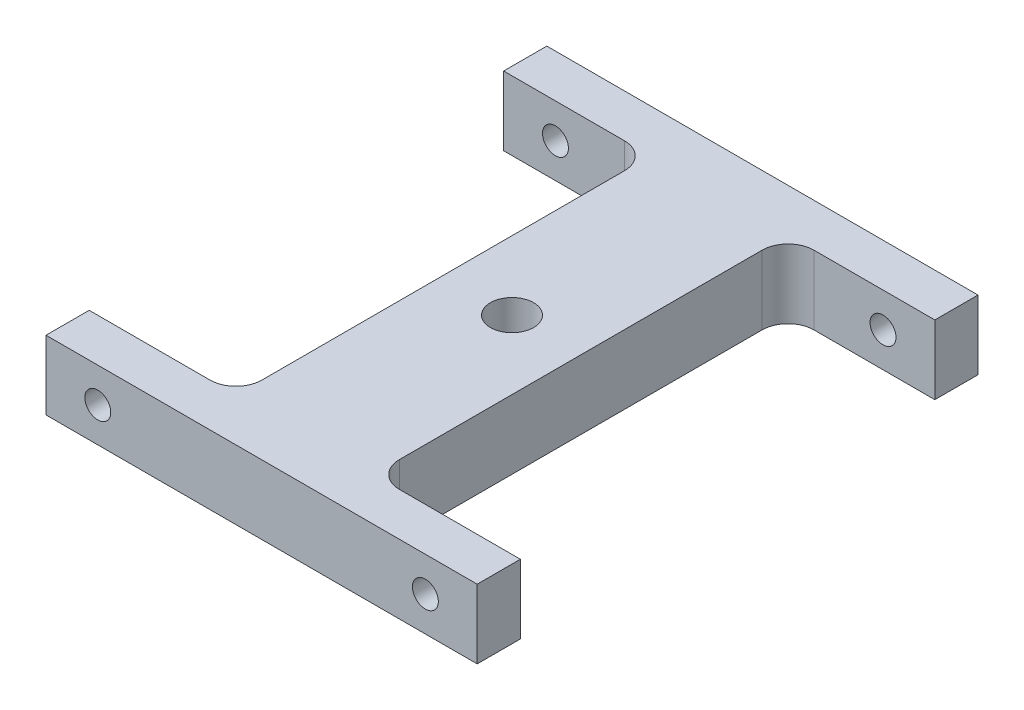
ISO-10303-21;
HEADER;
FILE_DESCRIPTION(('STEP AP214'),'2;1');
FILE_NAME('part.step','',(''),(''),'','','');
FILE_SCHEMA(('AUTOMOTIVE_DESIGN { 1 0 10303 214 1 1 1 1 }'));
ENDSEC;
DATA;
#1=APPLICATION_CONTEXT('core data for automotive mechanical design processes');
#2=APPLICATION_PROTOCOL_DEFINITION('international standard','automotive_design',2000,#1);
#3=PRODUCT_CONTEXT('',#1,'mechanical');
#4=PRODUCT('Part','Part','',(#3));
#5=PRODUCT_RELATED_PRODUCT_CATEGORY('part','',(#4));
#6=PRODUCT_DEFINITION_FORMATION('','',#4);
#7=PRODUCT_DEFINITION_CONTEXT('part definition',#1,'design');
#8=PRODUCT_DEFINITION('design','',#6,#7);
#9=PRODUCT_DEFINITION_SHAPE('','',#8);
#10=(LENGTH_UNIT() NAMED_UNIT(*) SI_UNIT(.MILLI.,.METRE.));
#11=(NAMED_UNIT(*) PLANE_ANGLE_UNIT() SI_UNIT($,.RADIAN.));
#12=(NAMED_UNIT(*) SI_UNIT($,.STERADIAN.) SOLID_ANGLE_UNIT());
#13=UNCERTAINTY_MEASURE_WITH_UNIT(LENGTH_MEASURE(1.E-05),#10,'distance_accuracy_value','');
#14=(GEOMETRIC_REPRESENTATION_CONTEXT(3) GLOBAL_UNCERTAINTY_ASSIGNED_CONTEXT((#13)) GLOBAL_UNIT_ASSIGNED_CONTEXT((#10,
#11,#12)) REPRESENTATION_CONTEXT('',''));
#15=CARTESIAN_POINT('',(0.,0.,0.));
#16=DIRECTION('',(0.,0.,1.));
#17=DIRECTION('',(1.,0.,0.));
#18=AXIS2_PLACEMENT_3D('',#15,#16,#17);
#19=CARTESIAN_POINT('',(-24.9677831353781,-110.,58.));
#20=DIRECTION('',(1.,0.,0.));
#21=DIRECTION('',(0.,0.,-1.));
#22=AXIS2_PLACEMENT_3D('',#19,#20,#21);
#23=PLANE('',#22);
#24=DIRECTION('',(0.,0.,-1.));
#25=VECTOR('',#24,1.);
#26=CARTESIAN_POINT('',(-24.9677831353781,-102.,58.));
#27=LINE('',#26,#25);
#28=CARTESIAN_POINT('',(-24.9677831353781,-102.,58.));
#29=VERTEX_POINT('',#28);
#30=CARTESIAN_POINT('',(-24.9677831353781,-102.,52.9999999999994));
#31=VERTEX_POINT('',#30);
#32=EDGE_CURVE('E297',#29,#31,#27,.T.);
#33=ORIENTED_EDGE('',*,*,#32,.T.);
#34=DIRECTION('',(0.,-1.,0.));
#35=VECTOR('',#34,1.);
#36=CARTESIAN_POINT('',(-24.9677831353781,-54.,52.9999999999994));
#37=LINE('',#36,#35);
#38=CARTESIAN_POINT('',(-24.9677831353781,-110.,52.9999999999994));
#39=VERTEX_POINT('',#38);
#40=EDGE_CURVE('E245',#31,#39,#37,.T.);
#41=ORIENTED_EDGE('',*,*,#40,.T.);
#42=DIRECTION('',(0.,0.,-1.));
#43=VECTOR('',#42,1.);
#44=CARTESIAN_POINT('',(-24.9677831353781,-110.,58.));
#45=LINE('',#44,#43);
#46=CARTESIAN_POINT('',(-24.9677831353781,-110.,58.));
#47=VERTEX_POINT('',#46);
#48=EDGE_CURVE('E174',#47,#39,#45,.T.);
#49=ORIENTED_EDGE('',*,*,#48,.F.);
#50=DIRECTION('',(0.,-1.,0.));
#51=VECTOR('',#50,1.);
#52=CARTESIAN_POINT('',(-24.9677831353781,-110.,58.));
#53=LINE('',#52,#51);
#54=EDGE_CURVE('E278',#29,#47,#53,.T.);
#55=ORIENTED_EDGE('',*,*,#54,.F.);
#56=EDGE_LOOP('',(#33,#41,#49,#55));
#57=FACE_BOUND('',#56,.T.);
#58=ADVANCED_FACE('F35',(#57),#23,.F.);
#59=CARTESIAN_POINT('',(24.967783135378,-110.,58.));
#60=DIRECTION('',(-1.,0.,0.));
#61=DIRECTION('',(0.,0.,1.));
#62=AXIS2_PLACEMENT_3D('',#59,#60,#61);
#63=PLANE('',#62);
#64=DIRECTION('',(0.,0.,-1.));
#65=VECTOR('',#64,1.);
#66=CARTESIAN_POINT('',(24.967783135378,-102.,58.));
#67=LINE('',#66,#65);
#68=CARTESIAN_POINT('',(24.9677831353781,-102.,5.));
#69=VERTEX_POINT('',#68);
#70=CARTESIAN_POINT('',(24.967783135378,-102.,0.));
#71=VERTEX_POINT('',#70);
#72=EDGE_CURVE('E299',#69,#71,#67,.T.);
#73=ORIENTED_EDGE('',*,*,#72,.F.);
#74=DIRECTION('',(0.,-1.,0.));
#75=VECTOR('',#74,1.);
#76=CARTESIAN_POINT('',(24.9677831353781,-54.,5.));
#77=LINE('',#76,#75);
#78=CARTESIAN_POINT('',(24.9677831353781,-110.,5.));
#79=VERTEX_POINT('',#78);
#80=EDGE_CURVE('E169',#69,#79,#77,.T.);
#81=ORIENTED_EDGE('',*,*,#80,.T.);
#82=DIRECTION('',(0.,0.,-1.));
#83=VECTOR('',#82,1.);
#84=CARTESIAN_POINT('',(24.967783135378,-110.,58.));
#85=LINE('',#84,#83);
#86=CARTESIAN_POINT('',(24.967783135378,-110.,0.));
#87=VERTEX_POINT('',#86);
#88=EDGE_CURVE('E179',#79,#87,#85,.T.);
#89=ORIENTED_EDGE('',*,*,#88,.T.);
#90=DIRECTION('',(0.,1.,0.));
#91=VECTOR('',#90,1.);
#92=CARTESIAN_POINT('',(24.967783135378,-110.,0.));
#93=LINE('',#92,#91);
#94=EDGE_CURVE('E292',#87,#71,#93,.T.);
#95=ORIENTED_EDGE('',*,*,#94,.T.);
#96=EDGE_LOOP('',(#73,#81,#89,#95));
#97=FACE_BOUND('',#96,.T.);
#98=ADVANCED_FACE('F310',(#97),#63,.F.);
#99=CARTESIAN_POINT('',(-24.9677831353781,-110.,4.99999999999999));
#100=VERTEX_POINT('',#99);
#101=CARTESIAN_POINT('',(-24.9677831353781,-110.,0.));
#102=VERTEX_POINT('',#101);
#103=EDGE_CURVE('E164',#100,#102,#45,.T.);
#104=ORIENTED_EDGE('',*,*,#103,.F.);
#105=DIRECTION('',(0.,-1.,0.));
#106=VECTOR('',#105,1.);
#107=CARTESIAN_POINT('',(-24.9677831353781,-54.,4.99999999999999));
#108=LINE('',#107,#106);
#109=CARTESIAN_POINT('',(-24.9677831353781,-102.,4.99999999999999));
#110=VERTEX_POINT('',#109);
#111=EDGE_CURVE('E148',#110,#100,#108,.T.);
#112=ORIENTED_EDGE('',*,*,#111,.F.);
#113=CARTESIAN_POINT('',(-24.9677831353781,-102.,0.));
#114=VERTEX_POINT('',#113);
#115=EDGE_CURVE('E288',#110,#114,#27,.T.);
#116=ORIENTED_EDGE('',*,*,#115,.T.);
#117=DIRECTION('',(0.,-1.,0.));
#118=VECTOR('',#117,1.);
#119=CARTESIAN_POINT('',(-24.9677831353781,-110.,0.));
#120=LINE('',#119,#118);
#121=EDGE_CURVE('E173',#114,#102,#120,.T.);
#122=ORIENTED_EDGE('',*,*,#121,.T.);
#123=EDGE_LOOP('',(#104,#112,#116,#122));
#124=FACE_BOUND('',#123,.T.);
#125=ADVANCED_FACE('F37',(#124),#23,.F.);
#126=CARTESIAN_POINT('',(-24.9677831353781,-110.,58.));
#127=DIRECTION('',(0.,1.,0.));
#128=DIRECTION('',(0.,0.,1.));
#129=AXIS2_PLACEMENT_3D('',#126,#127,#128);
#130=PLANE('',#129);
#131=CARTESIAN_POINT('',(0.,-110.,28.9999999999997));
#132=DIRECTION('',(0.,-1.,0.));
#133=DIRECTION('',(0.,0.,-1.));
#134=AXIS2_PLACEMENT_3D('',#131,#132,#133);
#135=CIRCLE('',#134,2.5);
#136=CARTESIAN_POINT('',(0.,-110.,26.4999999999997));
#137=VERTEX_POINT('',#136);
#138=EDGE_CURVE('E215',#137,#137,#135,.T.);
#139=ORIENTED_EDGE('',*,*,#138,.F.);
#140=EDGE_LOOP('',(#139));
#141=FACE_BOUND('',#140,.T.);
#142=ORIENTED_EDGE('',*,*,#48,.T.);
#143=DIRECTION('',(-1.,0.,0.));
#144=VECTOR('',#143,1.);
#145=CARTESIAN_POINT('',(-24.9677831353781,-110.,52.9999999999994));
#146=LINE('',#145,#144);
#147=CARTESIAN_POINT('',(-10.9677831353781,-110.,52.9999999999994));
#148=VERTEX_POINT('',#147);
#149=EDGE_CURVE('E158',#148,#39,#146,.T.);
#150=ORIENTED_EDGE('',*,*,#149,.F.);
#151=CARTESIAN_POINT('',(-10.9677831353781,-110.,49.9999999999994));
#152=DIRECTION('',(0.,-1.,0.));
#153=DIRECTION('',(0.,0.,1.));
#154=AXIS2_PLACEMENT_3D('',#151,#152,#153);
#155=CIRCLE('',#154,3.);
#156=CARTESIAN_POINT('',(-7.96778313537806,-110.,49.9999999999994));
#157=VERTEX_POINT('',#156);
#158=EDGE_CURVE('E241',#157,#148,#155,.T.);
#159=ORIENTED_EDGE('',*,*,#158,.F.);
#160=DIRECTION('',(0.,0.,1.));
#161=VECTOR('',#160,1.);
#162=CARTESIAN_POINT('',(-7.96778313537807,-110.,49.9999999999994));
#163=LINE('',#162,#161);
#164=CARTESIAN_POINT('',(-7.96778313537806,-110.,8.00000000000001));
#165=VERTEX_POINT('',#164);
#166=EDGE_CURVE('E238',#165,#157,#163,.T.);
#167=ORIENTED_EDGE('',*,*,#166,.F.);
#168=CARTESIAN_POINT('',(-10.9677831353781,-110.,7.99999999999999));
#169=DIRECTION('',(0.,-1.,0.));
#170=DIRECTION('',(0.,0.,-1.));
#171=AXIS2_PLACEMENT_3D('',#168,#169,#170);
#172=CIRCLE('',#171,3.);
#173=CARTESIAN_POINT('',(-10.9677831353781,-110.,4.99999999999999));
#174=VERTEX_POINT('',#173);
#175=EDGE_CURVE('E168',#174,#165,#172,.T.);
#176=ORIENTED_EDGE('',*,*,#175,.F.);
#177=DIRECTION('',(1.,0.,0.));
#178=VECTOR('',#177,1.);
#179=CARTESIAN_POINT('',(-24.9677831353781,-110.,4.99999999999999));
#180=LINE('',#179,#178);
#181=EDGE_CURVE('E151',#100,#174,#180,.T.);
#182=ORIENTED_EDGE('',*,*,#181,.F.);
#183=ORIENTED_EDGE('',*,*,#103,.T.);
#184=DIRECTION('',(1.,0.,0.));
#185=VECTOR('',#184,1.);
#186=CARTESIAN_POINT('',(-24.9677831353781,-110.,0.));
#187=LINE('',#186,#185);
#188=EDGE_CURVE('E290',#102,#87,#187,.T.);
#189=ORIENTED_EDGE('',*,*,#188,.T.);
#190=ORIENTED_EDGE('',*,*,#88,.F.);
#191=DIRECTION('',(1.,0.,0.));
#192=VECTOR('',#191,1.);
#193=CARTESIAN_POINT('',(24.9677831353781,-110.,5.));
#194=LINE('',#193,#192);
#195=CARTESIAN_POINT('',(10.9677831353781,-110.,5.));
#196=VERTEX_POINT('',#195);
#197=EDGE_CURVE('E265',#196,#79,#194,.T.);
#198=ORIENTED_EDGE('',*,*,#197,.F.);
#199=CARTESIAN_POINT('',(10.9677831353781,-110.,7.99999999999999));
#200=DIRECTION('',(0.,-1.,0.));
#201=DIRECTION('',(0.,0.,1.));
#202=AXIS2_PLACEMENT_3D('',#199,#200,#201);
#203=CIRCLE('',#202,3.);
#204=CARTESIAN_POINT('',(7.96778313537807,-110.,8.00000000000002));
#205=VERTEX_POINT('',#204);
#206=EDGE_CURVE('E262',#205,#196,#203,.T.);
#207=ORIENTED_EDGE('',*,*,#206,.F.);
#208=DIRECTION('',(0.,0.,-1.));
#209=VECTOR('',#208,1.);
#210=CARTESIAN_POINT('',(7.96778313537807,-110.,8.00000000000002));
#211=LINE('',#210,#209);
#212=CARTESIAN_POINT('',(7.96778313537807,-110.,49.9999999999994));
#213=VERTEX_POINT('',#212);
#214=EDGE_CURVE('E259',#213,#205,#211,.T.);
#215=ORIENTED_EDGE('',*,*,#214,.F.);
#216=CARTESIAN_POINT('',(10.9677831353781,-110.,49.9999999999994));
#217=DIRECTION('',(0.,-1.,0.));
#218=DIRECTION('',(0.,0.,-1.));
#219=AXIS2_PLACEMENT_3D('',#216,#217,#218);
#220=CIRCLE('',#219,3.);
#221=CARTESIAN_POINT('',(10.9677831353781,-110.,52.9999999999994));
#222=VERTEX_POINT('',#221);
#223=EDGE_CURVE('E256',#222,#213,#220,.T.);
#224=ORIENTED_EDGE('',*,*,#223,.F.);
#225=DIRECTION('',(-1.,0.,0.));
#226=VECTOR('',#225,1.);
#227=CARTESIAN_POINT('',(24.9677831353781,-110.,52.9999999999994));
#228=LINE('',#227,#226);
#229=CARTESIAN_POINT('',(24.9677831353781,-110.,52.9999999999994));
#230=VERTEX_POINT('',#229);
#231=EDGE_CURVE('E235',#230,#222,#228,.T.);
#232=ORIENTED_EDGE('',*,*,#231,.F.);
#233=CARTESIAN_POINT('',(24.967783135378,-110.,58.));
#234=VERTEX_POINT('',#233);
#235=EDGE_CURVE('E175',#234,#230,#85,.T.);
#236=ORIENTED_EDGE('',*,*,#235,.F.);
#237=DIRECTION('',(1.,0.,0.));
#238=VECTOR('',#237,1.);
#239=CARTESIAN_POINT('',(-24.9677831353781,-110.,58.));
#240=LINE('',#239,#238);
#241=EDGE_CURVE('E281',#47,#234,#240,.T.);
#242=ORIENTED_EDGE('',*,*,#241,.F.);
#243=EDGE_LOOP('',(#142,#150,#159,#167,#176,#182,#183,#189,#190,#198,#207,#215,#224,#232,#236,#242));
#244=FACE_BOUND('',#243,.T.);
#245=ADVANCED_FACE('F162',(#141,#244),#130,.F.);
#246=ORIENTED_EDGE('',*,*,#235,.T.);
#247=DIRECTION('',(0.,-1.,0.));
#248=VECTOR('',#247,1.);
#249=CARTESIAN_POINT('',(24.9677831353781,-54.,52.9999999999994));
#250=LINE('',#249,#248);
#251=CARTESIAN_POINT('',(24.9677831353781,-102.,52.9999999999994));
#252=VERTEX_POINT('',#251);
#253=EDGE_CURVE('E267',#252,#230,#250,.T.);
#254=ORIENTED_EDGE('',*,*,#253,.F.);
#255=CARTESIAN_POINT('',(24.967783135378,-102.,58.));
#256=VERTEX_POINT('',#255);
#257=EDGE_CURVE('E300',#256,#252,#67,.T.);
#258=ORIENTED_EDGE('',*,*,#257,.F.);
#259=DIRECTION('',(0.,1.,0.));
#260=VECTOR('',#259,1.);
#261=CARTESIAN_POINT('',(24.967783135378,-110.,58.));
#262=LINE('',#261,#260);
#263=EDGE_CURVE('E284',#234,#256,#262,.T.);
#264=ORIENTED_EDGE('',*,*,#263,.F.);
#265=EDGE_LOOP('',(#246,#254,#258,#264));
#266=FACE_BOUND('',#265,.T.);
#267=ADVANCED_FACE('F334',(#266),#63,.F.);
#268=CARTESIAN_POINT('',(-24.9677831353781,-102.,58.));
#269=DIRECTION('',(0.,-1.,0.));
#270=DIRECTION('',(0.,0.,-1.));
#271=AXIS2_PLACEMENT_3D('',#268,#269,#270);
#272=PLANE('',#271);
#273=CARTESIAN_POINT('',(0.,-102.,28.9999999999997));
#274=DIRECTION('',(0.,-1.,0.));
#275=DIRECTION('',(0.,0.,-1.));
#276=AXIS2_PLACEMENT_3D('',#273,#274,#275);
#277=CIRCLE('',#276,2.5);
#278=CARTESIAN_POINT('',(0.,-102.,26.4999999999997));
#279=VERTEX_POINT('',#278);
#280=EDGE_CURVE('E208',#279,#279,#277,.T.);
#281=ORIENTED_EDGE('',*,*,#280,.T.);
#282=EDGE_LOOP('',(#281));
#283=FACE_BOUND('',#282,.T.);
#284=CARTESIAN_POINT('',(-10.9677831353781,-102.,49.9999999999994));
#285=DIRECTION('',(0.,-1.,0.));
#286=DIRECTION('',(0.,0.,-1.));
#287=AXIS2_PLACEMENT_3D('',#284,#285,#286);
#288=CIRCLE('',#287,3.);
#289=CARTESIAN_POINT('',(-7.96778313537806,-102.,49.9999999999994));
#290=VERTEX_POINT('',#289);
#291=CARTESIAN_POINT('',(-10.9677831353781,-102.,52.9999999999994));
#292=VERTEX_POINT('',#291);
#293=EDGE_CURVE('E44',#290,#292,#288,.T.);
#294=ORIENTED_EDGE('',*,*,#293,.T.);
#295=DIRECTION('',(-1.,0.,0.));
#296=VECTOR('',#295,1.);
#297=CARTESIAN_POINT('',(-24.9677831353781,-102.,52.9999999999994));
#298=LINE('',#297,#296);
#299=EDGE_CURVE('E11',#292,#31,#298,.T.);
#300=ORIENTED_EDGE('',*,*,#299,.T.);
#301=ORIENTED_EDGE('',*,*,#32,.F.);
#302=DIRECTION('',(-1.,0.,0.));
#303=VECTOR('',#302,1.);
#304=CARTESIAN_POINT('',(-24.9677831353781,-102.,58.));
#305=LINE('',#304,#303);
#306=EDGE_CURVE('E286',#256,#29,#305,.T.);
#307=ORIENTED_EDGE('',*,*,#306,.F.);
#308=ORIENTED_EDGE('',*,*,#257,.T.);
#309=DIRECTION('',(-1.,0.,0.));
#310=VECTOR('',#309,1.);
#311=CARTESIAN_POINT('',(-24.9677831353781,-102.,52.9999999999994));
#312=LINE('',#311,#310);
#313=CARTESIAN_POINT('',(10.9677831353781,-102.,52.9999999999994));
#314=VERTEX_POINT('',#313);
#315=EDGE_CURVE('E177',#252,#314,#312,.T.);
#316=ORIENTED_EDGE('',*,*,#315,.T.);
#317=CARTESIAN_POINT('',(10.9677831353781,-102.,49.9999999999994));
#318=DIRECTION('',(0.,-1.,0.));
#319=DIRECTION('',(0.,0.,-1.));
#320=AXIS2_PLACEMENT_3D('',#317,#318,#319);
#321=CIRCLE('',#320,3.);
#322=CARTESIAN_POINT('',(7.96778313537807,-102.,49.9999999999994));
#323=VERTEX_POINT('',#322);
#324=EDGE_CURVE('E185',#314,#323,#321,.T.);
#325=ORIENTED_EDGE('',*,*,#324,.T.);
#326=DIRECTION('',(0.,0.,-1.));
#327=VECTOR('',#326,1.);
#328=CARTESIAN_POINT('',(7.96778313537807,-102.,58.));
#329=LINE('',#328,#327);
#330=CARTESIAN_POINT('',(7.96778313537807,-102.,8.00000000000002));
#331=VERTEX_POINT('',#330);
#332=EDGE_CURVE('E188',#323,#331,#329,.T.);
#333=ORIENTED_EDGE('',*,*,#332,.T.);
#334=CARTESIAN_POINT('',(10.9677831353781,-102.,7.99999999999999));
#335=DIRECTION('',(0.,-1.,0.));
#336=DIRECTION('',(0.,0.,-1.));
#337=AXIS2_PLACEMENT_3D('',#334,#335,#336);
#338=CIRCLE('',#337,3.);
#339=CARTESIAN_POINT('',(10.9677831353781,-102.,5.));
#340=VERTEX_POINT('',#339);
#341=EDGE_CURVE('E191',#331,#340,#338,.T.);
#342=ORIENTED_EDGE('',*,*,#341,.T.);
#343=DIRECTION('',(1.,0.,0.));
#344=VECTOR('',#343,1.);
#345=CARTESIAN_POINT('',(-24.9677831353781,-102.,4.99999999999999));
#346=LINE('',#345,#344);
#347=EDGE_CURVE('E194',#340,#69,#346,.T.);
#348=ORIENTED_EDGE('',*,*,#347,.T.);
#349=ORIENTED_EDGE('',*,*,#72,.T.);
#350=DIRECTION('',(-1.,0.,0.));
#351=VECTOR('',#350,1.);
#352=CARTESIAN_POINT('',(-24.9677831353781,-102.,0.));
#353=LINE('',#352,#351);
#354=EDGE_CURVE('E282',#71,#114,#353,.T.);
#355=ORIENTED_EDGE('',*,*,#354,.T.);
#356=ORIENTED_EDGE('',*,*,#115,.F.);
#357=DIRECTION('',(1.,0.,0.));
#358=VECTOR('',#357,1.);
#359=CARTESIAN_POINT('',(-24.9677831353781,-102.,4.99999999999999));
#360=LINE('',#359,#358);
#361=CARTESIAN_POINT('',(-10.9677831353781,-102.,4.99999999999999));
#362=VERTEX_POINT('',#361);
#363=EDGE_CURVE('E154',#110,#362,#360,.T.);
#364=ORIENTED_EDGE('',*,*,#363,.T.);
#365=CARTESIAN_POINT('',(-10.9677831353781,-102.,7.99999999999999));
#366=DIRECTION('',(0.,-1.,0.));
#367=DIRECTION('',(0.,0.,-1.));
#368=AXIS2_PLACEMENT_3D('',#365,#366,#367);
#369=CIRCLE('',#368,3.);
#370=CARTESIAN_POINT('',(-7.96778313537806,-102.,8.00000000000001));
#371=VERTEX_POINT('',#370);
#372=EDGE_CURVE('E198',#362,#371,#369,.T.);
#373=ORIENTED_EDGE('',*,*,#372,.T.);
#374=DIRECTION('',(0.,0.,1.));
#375=VECTOR('',#374,1.);
#376=CARTESIAN_POINT('',(-7.96778313537807,-102.,58.));
#377=LINE('',#376,#375);
#378=EDGE_CURVE('E201',#371,#290,#377,.T.);
#379=ORIENTED_EDGE('',*,*,#378,.T.);
#380=EDGE_LOOP('',(#294,#300,#301,#307,#308,#316,#325,#333,#342,#348,#349,#355,#356,#364,#373,#379));
#381=FACE_BOUND('',#380,.T.);
#382=ADVANCED_FACE('F306',(#283,#381),#272,.F.);
#383=CARTESIAN_POINT('',(0.,0.,58.));
#384=DIRECTION('',(0.,0.,-1.));
#385=DIRECTION('',(-1.,0.,0.));
#386=AXIS2_PLACEMENT_3D('',#383,#384,#385);
#387=PLANE('',#386);
#388=CARTESIAN_POINT('',(-18.9677831353781,-106.,58.));
#389=DIRECTION('',(0.,0.,-1.));
#390=DIRECTION('',(-1.,0.,0.));
#391=AXIS2_PLACEMENT_3D('',#388,#389,#390);
#392=CIRCLE('',#391,1.5);
#393=CARTESIAN_POINT('',(-20.4677831353781,-106.,58.));
#394=VERTEX_POINT('',#393);
#395=EDGE_CURVE('E224',#394,#394,#392,.F.);
#396=ORIENTED_EDGE('',*,*,#395,.F.);
#397=EDGE_LOOP('',(#396));
#398=FACE_BOUND('',#397,.T.);
#399=CARTESIAN_POINT('',(18.9677831353781,-106.,58.));
#400=DIRECTION('',(0.,0.,-1.));
#401=DIRECTION('',(-1.,0.,0.));
#402=AXIS2_PLACEMENT_3D('',#399,#400,#401);
#403=CIRCLE('',#402,1.5);
#404=CARTESIAN_POINT('',(17.4677831353781,-106.,58.));
#405=VERTEX_POINT('',#404);
#406=EDGE_CURVE('E233',#405,#405,#403,.F.);
#407=ORIENTED_EDGE('',*,*,#406,.F.);
#408=EDGE_LOOP('',(#407));
#409=FACE_BOUND('',#408,.T.);
#410=ORIENTED_EDGE('',*,*,#54,.T.);
#411=ORIENTED_EDGE('',*,*,#241,.T.);
#412=ORIENTED_EDGE('',*,*,#263,.T.);
#413=ORIENTED_EDGE('',*,*,#306,.T.);
#414=EDGE_LOOP('',(#410,#411,#412,#413));
#415=FACE_BOUND('',#414,.T.);
#416=ADVANCED_FACE('F340',(#398,#409,#415),#387,.F.);
#417=CARTESIAN_POINT('',(0.,0.,0.));
#418=DIRECTION('',(0.,0.,-1.));
#419=DIRECTION('',(-1.,0.,0.));
#420=AXIS2_PLACEMENT_3D('',#417,#418,#419);
#421=PLANE('',#420);
#422=CARTESIAN_POINT('',(-18.9677831353781,-106.,0.));
#423=DIRECTION('',(0.,0.,-1.));
#424=DIRECTION('',(-1.,0.,0.));
#425=AXIS2_PLACEMENT_3D('',#422,#423,#424);
#426=CIRCLE('',#425,1.5);
#427=CARTESIAN_POINT('',(-20.4677831353781,-106.,0.));
#428=VERTEX_POINT('',#427);
#429=EDGE_CURVE('E212',#428,#428,#426,.F.);
#430=ORIENTED_EDGE('',*,*,#429,.T.);
#431=EDGE_LOOP('',(#430));
#432=FACE_BOUND('',#431,.T.);
#433=CARTESIAN_POINT('',(18.9677831353781,-106.,0.));
#434=DIRECTION('',(0.,0.,-1.));
#435=DIRECTION('',(-1.,0.,0.));
#436=AXIS2_PLACEMENT_3D('',#433,#434,#435);
#437=CIRCLE('',#436,1.5);
#438=CARTESIAN_POINT('',(17.4677831353781,-106.,0.));
#439=VERTEX_POINT('',#438);
#440=EDGE_CURVE('E230',#439,#439,#437,.F.);
#441=ORIENTED_EDGE('',*,*,#440,.T.);
#442=EDGE_LOOP('',(#441));
#443=FACE_BOUND('',#442,.T.);
#444=ORIENTED_EDGE('',*,*,#121,.F.);
#445=ORIENTED_EDGE('',*,*,#354,.F.);
#446=ORIENTED_EDGE('',*,*,#94,.F.);
#447=ORIENTED_EDGE('',*,*,#188,.F.);
#448=EDGE_LOOP('',(#444,#445,#446,#447));
#449=FACE_BOUND('',#448,.T.);
#450=ADVANCED_FACE('F313',(#432,#443,#449),#421,.T.);
#451=CARTESIAN_POINT('',(24.9677831353781,-54.,5.));
#452=DIRECTION('',(0.,0.,-1.));
#453=DIRECTION('',(-1.,0.,0.));
#454=AXIS2_PLACEMENT_3D('',#451,#452,#453);
#455=PLANE('',#454);
#456=CARTESIAN_POINT('',(18.9677831353781,-106.,5.));
#457=DIRECTION('',(0.,0.,-1.));
#458=DIRECTION('',(-1.,0.,0.));
#459=AXIS2_PLACEMENT_3D('',#456,#457,#458);
#460=CIRCLE('',#459,1.5);
#461=CARTESIAN_POINT('',(17.4677831353781,-106.,5.));
#462=VERTEX_POINT('',#461);
#463=EDGE_CURVE('E227',#462,#462,#460,.F.);
#464=ORIENTED_EDGE('',*,*,#463,.F.);
#465=EDGE_LOOP('',(#464));
#466=FACE_BOUND('',#465,.T.);
#467=DIRECTION('',(0.,-1.,0.));
#468=VECTOR('',#467,1.);
#469=CARTESIAN_POINT('',(10.9677831353781,-54.,5.));
#470=LINE('',#469,#468);
#471=EDGE_CURVE('E270',#340,#196,#470,.T.);
#472=ORIENTED_EDGE('',*,*,#471,.T.);
#473=ORIENTED_EDGE('',*,*,#197,.T.);
#474=ORIENTED_EDGE('',*,*,#80,.F.);
#475=ORIENTED_EDGE('',*,*,#347,.F.);
#476=EDGE_LOOP('',(#472,#473,#474,#475));
#477=FACE_BOUND('',#476,.T.);
#478=ADVANCED_FACE('F318',(#466,#477),#455,.F.);
#479=CARTESIAN_POINT('',(10.9677831353781,-54.,7.99999999999999));
#480=DIRECTION('',(0.,-1.,0.));
#481=DIRECTION('',(0.,0.,-1.));
#482=AXIS2_PLACEMENT_3D('',#479,#480,#481);
#483=CYLINDRICAL_SURFACE('',#482,3.);
#484=DIRECTION('',(0.,-1.,0.));
#485=VECTOR('',#484,1.);
#486=CARTESIAN_POINT('',(7.96778313537807,-54.,8.00000000000002));
#487=LINE('',#486,#485);
#488=EDGE_CURVE('E272',#331,#205,#487,.T.);
#489=ORIENTED_EDGE('',*,*,#488,.T.);
#490=ORIENTED_EDGE('',*,*,#206,.T.);
#491=ORIENTED_EDGE('',*,*,#471,.F.);
#492=ORIENTED_EDGE('',*,*,#341,.F.);
#493=EDGE_LOOP('',(#489,#490,#491,#492));
#494=FACE_BOUND('',#493,.T.);
#495=ADVANCED_FACE('F321',(#494),#483,.F.);
#496=CARTESIAN_POINT('',(7.96778313537807,-54.,8.00000000000002));
#497=DIRECTION('',(-1.,0.,0.));
#498=DIRECTION('',(0.,0.,1.));
#499=AXIS2_PLACEMENT_3D('',#496,#497,#498);
#500=PLANE('',#499);
#501=DIRECTION('',(0.,-1.,0.));
#502=VECTOR('',#501,1.);
#503=CARTESIAN_POINT('',(7.96778313537807,-54.,49.9999999999994));
#504=LINE('',#503,#502);
#505=EDGE_CURVE('E274',#323,#213,#504,.T.);
#506=ORIENTED_EDGE('',*,*,#505,.T.);
#507=ORIENTED_EDGE('',*,*,#214,.T.);
#508=ORIENTED_EDGE('',*,*,#488,.F.);
#509=ORIENTED_EDGE('',*,*,#332,.F.);
#510=EDGE_LOOP('',(#506,#507,#508,#509));
#511=FACE_BOUND('',#510,.T.);
#512=ADVANCED_FACE('F324',(#511),#500,.F.);
#513=CARTESIAN_POINT('',(10.9677831353781,-54.,49.9999999999994));
#514=DIRECTION('',(0.,-1.,0.));
#515=DIRECTION('',(0.,0.,-1.));
#516=AXIS2_PLACEMENT_3D('',#513,#514,#515);
#517=CYLINDRICAL_SURFACE('',#516,3.);
#518=DIRECTION('',(0.,-1.,0.));
#519=VECTOR('',#518,1.);
#520=CARTESIAN_POINT('',(10.9677831353781,-54.,52.9999999999994));
#521=LINE('',#520,#519);
#522=EDGE_CURVE('E60',#314,#222,#521,.T.);
#523=ORIENTED_EDGE('',*,*,#522,.T.);
#524=ORIENTED_EDGE('',*,*,#223,.T.);
#525=ORIENTED_EDGE('',*,*,#505,.F.);
#526=ORIENTED_EDGE('',*,*,#324,.F.);
#527=EDGE_LOOP('',(#523,#524,#525,#526));
#528=FACE_BOUND('',#527,.T.);
#529=ADVANCED_FACE('F330',(#528),#517,.F.);
#530=CARTESIAN_POINT('',(24.9677831353781,-54.,52.9999999999994));
#531=DIRECTION('',(0.,0.,1.));
#532=DIRECTION('',(1.,0.,0.));
#533=AXIS2_PLACEMENT_3D('',#530,#531,#532);
#534=PLANE('',#533);
#535=CARTESIAN_POINT('',(18.9677831353781,-106.,52.9999999999994));
#536=DIRECTION('',(0.,0.,1.));
#537=DIRECTION('',(1.,0.,0.));
#538=AXIS2_PLACEMENT_3D('',#535,#536,#537);
#539=CIRCLE('',#538,1.5);
#540=CARTESIAN_POINT('',(20.4677831353781,-106.,52.9999999999994));
#541=VERTEX_POINT('',#540);
#542=EDGE_CURVE('E39',#541,#541,#539,.F.);
#543=ORIENTED_EDGE('',*,*,#542,.F.);
#544=EDGE_LOOP('',(#543));
#545=FACE_BOUND('',#544,.T.);
#546=ORIENTED_EDGE('',*,*,#253,.T.);
#547=ORIENTED_EDGE('',*,*,#231,.T.);
#548=ORIENTED_EDGE('',*,*,#522,.F.);
#549=ORIENTED_EDGE('',*,*,#315,.F.);
#550=EDGE_LOOP('',(#546,#547,#548,#549));
#551=FACE_BOUND('',#550,.T.);
#552=ADVANCED_FACE('F331',(#545,#551),#534,.F.);
#553=CARTESIAN_POINT('',(-24.9677831353781,-54.,52.9999999999994));
#554=DIRECTION('',(0.,0.,1.));
#555=DIRECTION('',(1.,0.,0.));
#556=AXIS2_PLACEMENT_3D('',#553,#554,#555);
#557=PLANE('',#556);
#558=CARTESIAN_POINT('',(-18.9677831353781,-106.,52.9999999999994));
#559=DIRECTION('',(0.,0.,1.));
#560=DIRECTION('',(1.,0.,0.));
#561=AXIS2_PLACEMENT_3D('',#558,#559,#560);
#562=CIRCLE('',#561,1.5);
#563=CARTESIAN_POINT('',(-17.4677831353781,-106.,52.9999999999994));
#564=VERTEX_POINT('',#563);
#565=EDGE_CURVE('E207',#564,#564,#562,.F.);
#566=ORIENTED_EDGE('',*,*,#565,.F.);
#567=EDGE_LOOP('',(#566));
#568=FACE_BOUND('',#567,.T.);
#569=DIRECTION('',(0.,-1.,0.));
#570=VECTOR('',#569,1.);
#571=CARTESIAN_POINT('',(-10.9677831353781,-54.,52.9999999999994));
#572=LINE('',#571,#570);
#573=EDGE_CURVE('E248',#292,#148,#572,.T.);
#574=ORIENTED_EDGE('',*,*,#573,.T.);
#575=ORIENTED_EDGE('',*,*,#149,.T.);
#576=ORIENTED_EDGE('',*,*,#40,.F.);
#577=ORIENTED_EDGE('',*,*,#299,.F.);
#578=EDGE_LOOP('',(#574,#575,#576,#577));
#579=FACE_BOUND('',#578,.T.);
#580=ADVANCED_FACE('F344',(#568,#579),#557,.F.);
#581=CARTESIAN_POINT('',(-10.9677831353781,-54.,49.9999999999994));
#582=DIRECTION('',(0.,-1.,0.));
#583=DIRECTION('',(0.,0.,-1.));
#584=AXIS2_PLACEMENT_3D('',#581,#582,#583);
#585=CYLINDRICAL_SURFACE('',#584,3.);
#586=DIRECTION('',(0.,-1.,0.));
#587=VECTOR('',#586,1.);
#588=CARTESIAN_POINT('',(-7.96778313537806,-54.,49.9999999999994));
#589=LINE('',#588,#587);
#590=EDGE_CURVE('E250',#290,#157,#589,.T.);
#591=ORIENTED_EDGE('',*,*,#590,.T.);
#592=ORIENTED_EDGE('',*,*,#158,.T.);
#593=ORIENTED_EDGE('',*,*,#573,.F.);
#594=ORIENTED_EDGE('',*,*,#293,.F.);
#595=EDGE_LOOP('',(#591,#592,#593,#594));
#596=FACE_BOUND('',#595,.T.);
#597=ADVANCED_FACE('F348',(#596),#585,.F.);
#598=CARTESIAN_POINT('',(-7.96778313537807,-54.,49.9999999999994));
#599=DIRECTION('',(1.,0.,0.));
#600=DIRECTION('',(0.,0.,-1.));
#601=AXIS2_PLACEMENT_3D('',#598,#599,#600);
#602=PLANE('',#601);
#603=DIRECTION('',(0.,-1.,0.));
#604=VECTOR('',#603,1.);
#605=CARTESIAN_POINT('',(-7.96778313537806,-54.,8.00000000000001));
#606=LINE('',#605,#604);
#607=EDGE_CURVE('E252',#371,#165,#606,.T.);
#608=ORIENTED_EDGE('',*,*,#607,.T.);
#609=ORIENTED_EDGE('',*,*,#166,.T.);
#610=ORIENTED_EDGE('',*,*,#590,.F.);
#611=ORIENTED_EDGE('',*,*,#378,.F.);
#612=EDGE_LOOP('',(#608,#609,#610,#611));
#613=FACE_BOUND('',#612,.T.);
#614=ADVANCED_FACE('F350',(#613),#602,.F.);
#615=CARTESIAN_POINT('',(-10.9677831353781,-54.,7.99999999999999));
#616=DIRECTION('',(0.,-1.,0.));
#617=DIRECTION('',(0.,0.,-1.));
#618=AXIS2_PLACEMENT_3D('',#615,#616,#617);
#619=CYLINDRICAL_SURFACE('',#618,3.);
#620=DIRECTION('',(0.,-1.,0.));
#621=VECTOR('',#620,1.);
#622=CARTESIAN_POINT('',(-10.9677831353781,-54.,4.99999999999999));
#623=LINE('',#622,#621);
#624=EDGE_CURVE('E52',#362,#174,#623,.T.);
#625=ORIENTED_EDGE('',*,*,#624,.T.);
#626=ORIENTED_EDGE('',*,*,#175,.T.);
#627=ORIENTED_EDGE('',*,*,#607,.F.);
#628=ORIENTED_EDGE('',*,*,#372,.F.);
#629=EDGE_LOOP('',(#625,#626,#627,#628));
#630=FACE_BOUND('',#629,.T.);
#631=ADVANCED_FACE('F354',(#630),#619,.F.);
#632=CARTESIAN_POINT('',(-24.9677831353781,-54.,4.99999999999999));
#633=DIRECTION('',(0.,0.,-1.));
#634=DIRECTION('',(-1.,0.,0.));
#635=AXIS2_PLACEMENT_3D('',#632,#633,#634);
#636=PLANE('',#635);
#637=CARTESIAN_POINT('',(-18.9677831353781,-106.,4.99999999999999));
#638=DIRECTION('',(0.,0.,-1.));
#639=DIRECTION('',(-1.,0.,0.));
#640=AXIS2_PLACEMENT_3D('',#637,#638,#639);
#641=CIRCLE('',#640,1.5);
#642=CARTESIAN_POINT('',(-20.4677831353781,-106.,4.99999999999999));
#643=VERTEX_POINT('',#642);
#644=EDGE_CURVE('E205',#643,#643,#641,.F.);
#645=ORIENTED_EDGE('',*,*,#644,.F.);
#646=EDGE_LOOP('',(#645));
#647=FACE_BOUND('',#646,.T.);
#648=ORIENTED_EDGE('',*,*,#111,.T.);
#649=ORIENTED_EDGE('',*,*,#181,.T.);
#650=ORIENTED_EDGE('',*,*,#624,.F.);
#651=ORIENTED_EDGE('',*,*,#363,.F.);
#652=EDGE_LOOP('',(#648,#649,#650,#651));
#653=FACE_BOUND('',#652,.T.);
#654=ADVANCED_FACE('F150',(#647,#653),#636,.F.);
#655=CARTESIAN_POINT('',(-18.9677831353781,-106.,-13.0000000000006));
#656=DIRECTION('',(0.,0.,1.));
#657=DIRECTION('',(1.,0.,0.));
#658=AXIS2_PLACEMENT_3D('',#655,#656,#657);
#659=CYLINDRICAL_SURFACE('',#658,1.5);
#660=ORIENTED_EDGE('',*,*,#429,.F.);
#661=EDGE_LOOP('',(#660));
#662=FACE_BOUND('',#661,.T.);
#663=ORIENTED_EDGE('',*,*,#644,.T.);
#664=EDGE_LOOP('',(#663));
#665=FACE_BOUND('',#664,.T.);
#666=ADVANCED_FACE('F361',(#662,#665),#659,.F.);
#667=ORIENTED_EDGE('',*,*,#565,.T.);
#668=EDGE_LOOP('',(#667));
#669=FACE_BOUND('',#668,.T.);
#670=ORIENTED_EDGE('',*,*,#395,.T.);
#671=EDGE_LOOP('',(#670));
#672=FACE_BOUND('',#671,.T.);
#673=ADVANCED_FACE('F415',(#669,#672),#659,.F.);
#674=CARTESIAN_POINT('',(18.9677831353781,-106.,-13.0000000000006));
#675=DIRECTION('',(0.,0.,1.));
#676=DIRECTION('',(1.,0.,0.));
#677=AXIS2_PLACEMENT_3D('',#674,#675,#676);
#678=CYLINDRICAL_SURFACE('',#677,1.5);
#679=ORIENTED_EDGE('',*,*,#542,.T.);
#680=EDGE_LOOP('',(#679));
#681=FACE_BOUND('',#680,.T.);
#682=ORIENTED_EDGE('',*,*,#406,.T.);
#683=EDGE_LOOP('',(#682));
#684=FACE_BOUND('',#683,.T.);
#685=ADVANCED_FACE('F406',(#681,#684),#678,.F.);
#686=ORIENTED_EDGE('',*,*,#440,.F.);
#687=EDGE_LOOP('',(#686));
#688=FACE_BOUND('',#687,.T.);
#689=ORIENTED_EDGE('',*,*,#463,.T.);
#690=EDGE_LOOP('',(#689));
#691=FACE_BOUND('',#690,.T.);
#692=ADVANCED_FACE('F403',(#688,#691),#678,.F.);
#693=CARTESIAN_POINT('',(0.,-102.,28.9999999999997));
#694=DIRECTION('',(0.,-1.,0.));
#695=DIRECTION('',(0.,0.,-1.));
#696=AXIS2_PLACEMENT_3D('',#693,#694,#695);
#697=CYLINDRICAL_SURFACE('',#696,2.5);
#698=ORIENTED_EDGE('',*,*,#280,.F.);
#699=EDGE_LOOP('',(#698));
#700=FACE_BOUND('',#699,.T.);
#701=ORIENTED_EDGE('',*,*,#138,.T.);
#702=EDGE_LOOP('',(#701));
#703=FACE_BOUND('',#702,.T.);
#704=ADVANCED_FACE('F405',(#700,#703),#697,.F.);
#705=CLOSED_SHELL('',(#58,#98,#125,#245,#267,#382,#416,#450,#478,#495,#512,#529,#552,#580,#597,
#614,#631,#654,#666,#673,#685,#692,#704));
#706=MANIFOLD_SOLID_BREP('B2',#705);
#707=ADVANCED_BREP_SHAPE_REPRESENTATION('',(#18,#706),#14);
#708=SHAPE_DEFINITION_REPRESENTATION(#9,#707);
ENDSEC;
END-ISO-10303-21;
